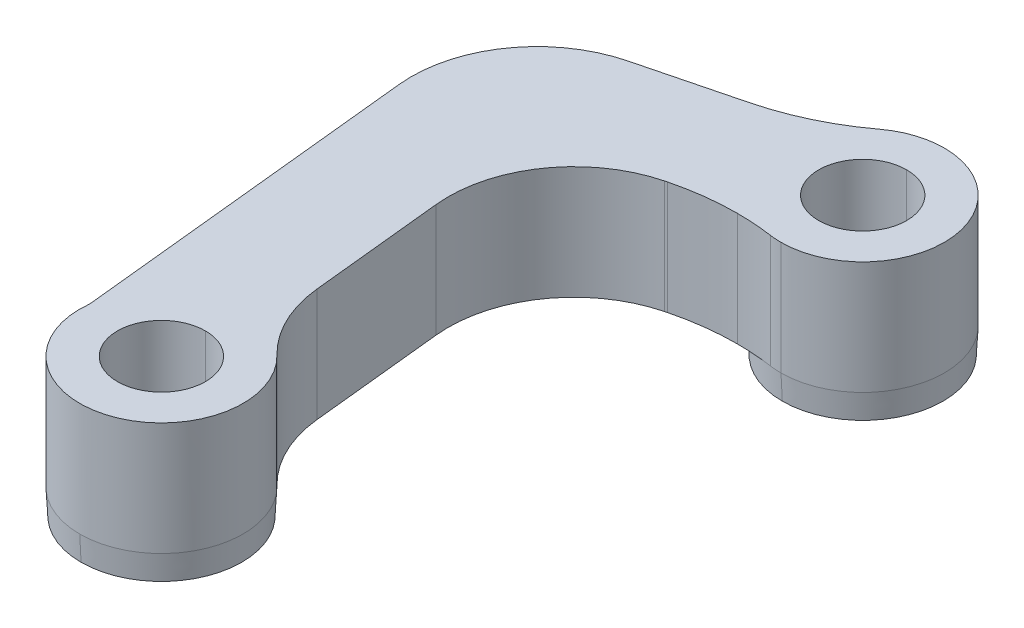
ISO-10303-21;
HEADER;
FILE_DESCRIPTION(('STEP AP214'),'2;1');
FILE_NAME('part.step','',(''),(''),'','','');
FILE_SCHEMA(('AUTOMOTIVE_DESIGN { 1 0 10303 214 1 1 1 1 }'));
ENDSEC;
DATA;
#1=APPLICATION_CONTEXT('core data for automotive mechanical design processes');
#2=APPLICATION_PROTOCOL_DEFINITION('international standard','automotive_design',2000,#1);
#3=PRODUCT_CONTEXT('',#1,'mechanical');
#4=PRODUCT('Part','Part','',(#3));
#5=PRODUCT_RELATED_PRODUCT_CATEGORY('part','',(#4));
#6=PRODUCT_DEFINITION_FORMATION('','',#4);
#7=PRODUCT_DEFINITION_CONTEXT('part definition',#1,'design');
#8=PRODUCT_DEFINITION('design','',#6,#7);
#9=PRODUCT_DEFINITION_SHAPE('','',#8);
#10=(LENGTH_UNIT() NAMED_UNIT(*) SI_UNIT(.MILLI.,.METRE.));
#11=(NAMED_UNIT(*) PLANE_ANGLE_UNIT() SI_UNIT($,.RADIAN.));
#12=(NAMED_UNIT(*) SI_UNIT($,.STERADIAN.) SOLID_ANGLE_UNIT());
#13=UNCERTAINTY_MEASURE_WITH_UNIT(LENGTH_MEASURE(1.E-05),#10,'distance_accuracy_value','');
#14=(GEOMETRIC_REPRESENTATION_CONTEXT(3) GLOBAL_UNCERTAINTY_ASSIGNED_CONTEXT((#13)) GLOBAL_UNIT_ASSIGNED_CONTEXT((#10,
#11,#12)) REPRESENTATION_CONTEXT('',''));
#15=CARTESIAN_POINT('',(0.,0.,0.));
#16=DIRECTION('',(0.,0.,1.));
#17=DIRECTION('',(1.,0.,0.));
#18=AXIS2_PLACEMENT_3D('',#15,#16,#17);
#19=CARTESIAN_POINT('',(8.4,0.,-19.5));
#20=DIRECTION('',(0.,-1.,0.));
#21=DIRECTION('',(0.,0.,-1.));
#22=AXIS2_PLACEMENT_3D('',#19,#20,#21);
#23=CONICAL_SURFACE('',#22,1.75,0.0523598775598306);
#24=DIRECTION('',(0.,-0.998629534754574,0.0523359562429439));
#25=VECTOR('',#24,1.);
#26=CARTESIAN_POINT('',(8.4,0.,-17.75));
#27=LINE('',#26,#25);
#28=CARTESIAN_POINT('',(8.4,0.,-17.75));
#29=VERTEX_POINT('',#28);
#30=CARTESIAN_POINT('',(8.4,-1.,-17.6975922207169));
#31=VERTEX_POINT('',#30);
#32=EDGE_CURVE('E479',#29,#31,#27,.T.);
#33=ORIENTED_EDGE('',*,*,#32,.F.);
#34=CARTESIAN_POINT('',(8.4,0.,-19.5));
#35=DIRECTION('',(0.,1.,0.));
#36=DIRECTION('',(0.,0.,1.));
#37=AXIS2_PLACEMENT_3D('',#34,#35,#36);
#38=CIRCLE('',#37,1.75);
#39=CARTESIAN_POINT('',(8.4,0.,-21.25));
#40=VERTEX_POINT('',#39);
#41=EDGE_CURVE('E94',#29,#40,#38,.T.);
#42=ORIENTED_EDGE('',*,*,#41,.T.);
#43=DIRECTION('',(0.,-0.998629534754574,-0.0523359562429439));
#44=VECTOR('',#43,1.);
#45=CARTESIAN_POINT('',(8.4,0.,-21.25));
#46=LINE('',#45,#44);
#47=CARTESIAN_POINT('',(8.4,-1.,-21.3024077792831));
#48=VERTEX_POINT('',#47);
#49=EDGE_CURVE('E478',#40,#48,#46,.T.);
#50=ORIENTED_EDGE('',*,*,#49,.T.);
#51=CARTESIAN_POINT('',(8.4,-1.,-19.5));
#52=DIRECTION('',(0.,-1.,0.));
#53=DIRECTION('',(0.,0.,-1.));
#54=AXIS2_PLACEMENT_3D('',#51,#52,#53);
#55=CIRCLE('',#54,1.80240777928305);
#56=EDGE_CURVE('E11',#48,#31,#55,.T.);
#57=ORIENTED_EDGE('',*,*,#56,.T.);
#58=EDGE_LOOP('',(#33,#42,#50,#57));
#59=FACE_BOUND('',#58,.T.);
#60=ADVANCED_FACE('F17',(#59),#23,.F.);
#61=CARTESIAN_POINT('',(8.4,0.,-19.5));
#62=DIRECTION('',(0.,1.,0.));
#63=DIRECTION('',(0.,0.,-1.));
#64=AXIS2_PLACEMENT_3D('',#61,#62,#63);
#65=CONICAL_SURFACE('',#64,3.25,0.0523598775598306);
#66=DIRECTION('',(0.,0.998629534754574,0.0523359562429439));
#67=VECTOR('',#66,1.);
#68=CARTESIAN_POINT('',(8.4,0.,-16.25));
#69=LINE('',#68,#67);
#70=CARTESIAN_POINT('',(8.4,-1.,-16.302407779283));
#71=VERTEX_POINT('',#70);
#72=CARTESIAN_POINT('',(8.4,0.,-16.25));
#73=VERTEX_POINT('',#72);
#74=EDGE_CURVE('E460',#71,#73,#69,.T.);
#75=ORIENTED_EDGE('',*,*,#74,.F.);
#76=CARTESIAN_POINT('',(8.4,-1.,-19.5));
#77=DIRECTION('',(0.,-1.,0.));
#78=DIRECTION('',(0.,0.,-1.));
#79=AXIS2_PLACEMENT_3D('',#76,#77,#78);
#80=CIRCLE('',#79,3.19759222071696);
#81=CARTESIAN_POINT('',(8.4,-1.,-22.6975922207169));
#82=VERTEX_POINT('',#81);
#83=EDGE_CURVE('E26',#82,#71,#80,.T.);
#84=ORIENTED_EDGE('',*,*,#83,.F.);
#85=DIRECTION('',(0.,0.998629534754574,-0.0523359562429439));
#86=VECTOR('',#85,1.);
#87=CARTESIAN_POINT('',(8.4,0.,-22.75));
#88=LINE('',#87,#86);
#89=CARTESIAN_POINT('',(8.4,0.,-22.75));
#90=VERTEX_POINT('',#89);
#91=EDGE_CURVE('E448',#82,#90,#88,.T.);
#92=ORIENTED_EDGE('',*,*,#91,.T.);
#93=CARTESIAN_POINT('',(8.4,0.,-19.5));
#94=DIRECTION('',(0.,1.,0.));
#95=DIRECTION('',(0.,0.,1.));
#96=AXIS2_PLACEMENT_3D('',#93,#94,#95);
#97=CIRCLE('',#96,3.25);
#98=EDGE_CURVE('E261',#73,#90,#97,.T.);
#99=ORIENTED_EDGE('',*,*,#98,.F.);
#100=EDGE_LOOP('',(#75,#84,#92,#99));
#101=FACE_BOUND('',#100,.T.);
#102=ADVANCED_FACE('F578',(#101),#65,.T.);
#103=CARTESIAN_POINT('',(8.4,-1.,-19.5));
#104=DIRECTION('',(0.,-1.,0.));
#105=DIRECTION('',(-1.,0.,0.));
#106=AXIS2_PLACEMENT_3D('',#103,#104,#105);
#107=PLANE('',#106);
#108=ORIENTED_EDGE('',*,*,#56,.F.);
#109=CARTESIAN_POINT('',(8.4,-1.,-19.5));
#110=DIRECTION('',(0.,-1.,0.));
#111=DIRECTION('',(0.,0.,-1.));
#112=AXIS2_PLACEMENT_3D('',#109,#110,#111);
#113=CIRCLE('',#112,1.80240777928305);
#114=EDGE_CURVE('E474',#31,#48,#113,.T.);
#115=ORIENTED_EDGE('',*,*,#114,.F.);
#116=EDGE_LOOP('',(#108,#115));
#117=FACE_BOUND('',#116,.T.);
#118=ORIENTED_EDGE('',*,*,#83,.T.);
#119=CARTESIAN_POINT('',(8.4,-1.,-19.5));
#120=DIRECTION('',(0.,-1.,0.));
#121=DIRECTION('',(0.,0.,-1.));
#122=AXIS2_PLACEMENT_3D('',#119,#120,#121);
#123=CIRCLE('',#122,3.19759222071696);
#124=EDGE_CURVE('E464',#71,#82,#123,.T.);
#125=ORIENTED_EDGE('',*,*,#124,.T.);
#126=EDGE_LOOP('',(#118,#125));
#127=FACE_BOUND('',#126,.T.);
#128=ADVANCED_FACE('F588',(#117,#127),#107,.T.);
#129=CARTESIAN_POINT('',(0.,0.,0.));
#130=DIRECTION('',(0.,-1.,0.));
#131=DIRECTION('',(0.,0.,-1.));
#132=AXIS2_PLACEMENT_3D('',#129,#130,#131);
#133=CONICAL_SURFACE('',#132,1.75,0.0523598775598306);
#134=DIRECTION('',(0.,-0.998629534754574,0.0523359562429439));
#135=VECTOR('',#134,1.);
#136=CARTESIAN_POINT('',(0.,0.,1.75));
#137=LINE('',#136,#135);
#138=CARTESIAN_POINT('',(0.,0.,1.75));
#139=VERTEX_POINT('',#138);
#140=CARTESIAN_POINT('',(0.,-1.,1.80240777928304));
#141=VERTEX_POINT('',#140);
#142=EDGE_CURVE('E229',#139,#141,#137,.T.);
#143=ORIENTED_EDGE('',*,*,#142,.F.);
#144=CARTESIAN_POINT('',(0.,0.,0.));
#145=DIRECTION('',(0.,1.,0.));
#146=DIRECTION('',(0.,0.,1.));
#147=AXIS2_PLACEMENT_3D('',#144,#145,#146);
#148=CIRCLE('',#147,1.75);
#149=CARTESIAN_POINT('',(0.,0.,-1.75));
#150=VERTEX_POINT('',#149);
#151=EDGE_CURVE('E142',#139,#150,#148,.T.);
#152=ORIENTED_EDGE('',*,*,#151,.T.);
#153=DIRECTION('',(0.,-0.998629534754574,-0.0523359562429439));
#154=VECTOR('',#153,1.);
#155=CARTESIAN_POINT('',(0.,0.,-1.75));
#156=LINE('',#155,#154);
#157=CARTESIAN_POINT('',(0.,-1.,-1.80240777928304));
#158=VERTEX_POINT('',#157);
#159=EDGE_CURVE('E237',#150,#158,#156,.T.);
#160=ORIENTED_EDGE('',*,*,#159,.T.);
#161=CARTESIAN_POINT('',(0.,-1.,0.));
#162=DIRECTION('',(0.,-1.,0.));
#163=DIRECTION('',(0.,0.,-1.));
#164=AXIS2_PLACEMENT_3D('',#161,#162,#163);
#165=CIRCLE('',#164,1.80240777928304);
#166=EDGE_CURVE('E20',#158,#141,#165,.T.);
#167=ORIENTED_EDGE('',*,*,#166,.T.);
#168=EDGE_LOOP('',(#143,#152,#160,#167));
#169=FACE_BOUND('',#168,.T.);
#170=ADVANCED_FACE('F598',(#169),#133,.F.);
#171=CARTESIAN_POINT('',(0.,0.,0.));
#172=DIRECTION('',(0.,1.,0.));
#173=DIRECTION('',(0.,0.,-1.));
#174=AXIS2_PLACEMENT_3D('',#171,#172,#173);
#175=CONICAL_SURFACE('',#174,3.25,0.0523598775598306);
#176=DIRECTION('',(0.,0.998629534754574,0.0523359562429439));
#177=VECTOR('',#176,1.);
#178=CARTESIAN_POINT('',(0.,0.,3.25));
#179=LINE('',#178,#177);
#180=CARTESIAN_POINT('',(0.,-1.,3.19759222071696));
#181=VERTEX_POINT('',#180);
#182=CARTESIAN_POINT('',(0.,0.,3.25));
#183=VERTEX_POINT('',#182);
#184=EDGE_CURVE('E248',#181,#183,#179,.T.);
#185=ORIENTED_EDGE('',*,*,#184,.F.);
#186=CARTESIAN_POINT('',(0.,-1.,0.));
#187=DIRECTION('',(0.,-1.,0.));
#188=DIRECTION('',(0.,0.,-1.));
#189=AXIS2_PLACEMENT_3D('',#186,#187,#188);
#190=CIRCLE('',#189,3.19759222071696);
#191=CARTESIAN_POINT('',(0.,-1.,-3.19759222071696));
#192=VERTEX_POINT('',#191);
#193=EDGE_CURVE('E163',#192,#181,#190,.T.);
#194=ORIENTED_EDGE('',*,*,#193,.F.);
#195=DIRECTION('',(0.,0.998629534754574,-0.0523359562429439));
#196=VECTOR('',#195,1.);
#197=CARTESIAN_POINT('',(0.,0.,-3.25));
#198=LINE('',#197,#196);
#199=CARTESIAN_POINT('',(0.,0.,-3.25));
#200=VERTEX_POINT('',#199);
#201=EDGE_CURVE('E260',#192,#200,#198,.T.);
#202=ORIENTED_EDGE('',*,*,#201,.T.);
#203=CARTESIAN_POINT('',(0.,0.,0.));
#204=DIRECTION('',(0.,-1.,0.));
#205=DIRECTION('',(0.,0.,-1.));
#206=AXIS2_PLACEMENT_3D('',#203,#204,#205);
#207=CIRCLE('',#206,3.25);
#208=CARTESIAN_POINT('',(2.26618996291476,0.,-2.32956713832943));
#209=VERTEX_POINT('',#208);
#210=EDGE_CURVE('E185',#200,#209,#207,.T.);
#211=ORIENTED_EDGE('',*,*,#210,.T.);
#212=CARTESIAN_POINT('',(0.,0.,0.));
#213=DIRECTION('',(0.,1.,0.));
#214=DIRECTION('',(0.,0.,1.));
#215=AXIS2_PLACEMENT_3D('',#212,#213,#214);
#216=CIRCLE('',#215,3.25);
#217=EDGE_CURVE('E125',#183,#209,#216,.T.);
#218=ORIENTED_EDGE('',*,*,#217,.F.);
#219=EDGE_LOOP('',(#185,#194,#202,#211,#218));
#220=FACE_BOUND('',#219,.T.);
#221=ADVANCED_FACE('F354',(#220),#175,.T.);
#222=CARTESIAN_POINT('',(0.,-1.,0.));
#223=DIRECTION('',(0.,-1.,0.));
#224=DIRECTION('',(-1.,0.,0.));
#225=AXIS2_PLACEMENT_3D('',#222,#223,#224);
#226=PLANE('',#225);
#227=ORIENTED_EDGE('',*,*,#166,.F.);
#228=CARTESIAN_POINT('',(0.,-1.,0.));
#229=DIRECTION('',(0.,-1.,0.));
#230=DIRECTION('',(0.,0.,-1.));
#231=AXIS2_PLACEMENT_3D('',#228,#229,#230);
#232=CIRCLE('',#231,1.80240777928304);
#233=EDGE_CURVE('E233',#141,#158,#232,.T.);
#234=ORIENTED_EDGE('',*,*,#233,.F.);
#235=EDGE_LOOP('',(#227,#234));
#236=FACE_BOUND('',#235,.T.);
#237=ORIENTED_EDGE('',*,*,#193,.T.);
#238=CARTESIAN_POINT('',(0.,-1.,0.));
#239=DIRECTION('',(0.,-1.,0.));
#240=DIRECTION('',(0.,0.,-1.));
#241=AXIS2_PLACEMENT_3D('',#238,#239,#240);
#242=CIRCLE('',#241,3.19759222071696);
#243=EDGE_CURVE('E240',#181,#192,#242,.T.);
#244=ORIENTED_EDGE('',*,*,#243,.T.);
#245=EDGE_LOOP('',(#237,#244));
#246=FACE_BOUND('',#245,.T.);
#247=ADVANCED_FACE('F619',(#236,#246),#226,.T.);
#248=CARTESIAN_POINT('',(0.481766502932818,4.5,-30.1237506694163));
#249=DIRECTION('',(0.,-1.,0.));
#250=DIRECTION('',(0.,0.,-1.));
#251=AXIS2_PLACEMENT_3D('',#248,#249,#250);
#252=CYLINDRICAL_SURFACE('',#251,10.);
#253=CARTESIAN_POINT('',(0.481766502932818,4.5,-30.1237506694163));
#254=DIRECTION('',(0.,-1.,0.));
#255=DIRECTION('',(0.,0.,1.));
#256=AXIS2_PLACEMENT_3D('',#253,#254,#255);
#257=CIRCLE('',#256,10.);
#258=CARTESIAN_POINT('',(6.45779178373823,4.5,-22.1058256358946));
#259=VERTEX_POINT('',#258);
#260=CARTESIAN_POINT('',(2.9510323862635,4.5,-20.4334087767161));
#261=VERTEX_POINT('',#260);
#262=EDGE_CURVE('E161',#259,#261,#257,.T.);
#263=ORIENTED_EDGE('',*,*,#262,.F.);
#264=DIRECTION('',(0.,1.,0.));
#265=VECTOR('',#264,1.);
#266=CARTESIAN_POINT('',(6.45779178373823,4.5,-22.1058256358946));
#267=LINE('',#266,#265);
#268=CARTESIAN_POINT('',(6.45779178373824,0.,-22.1058256358946));
#269=VERTEX_POINT('',#268);
#270=EDGE_CURVE('E247',#269,#259,#267,.T.);
#271=ORIENTED_EDGE('',*,*,#270,.F.);
#272=CARTESIAN_POINT('',(0.481766502932818,0.,-30.1237506694163));
#273=DIRECTION('',(0.,1.,0.));
#274=DIRECTION('',(0.,0.,1.));
#275=AXIS2_PLACEMENT_3D('',#272,#273,#274);
#276=CIRCLE('',#275,10.);
#277=CARTESIAN_POINT('',(2.9510323862635,0.,-20.4334087767161));
#278=VERTEX_POINT('',#277);
#279=EDGE_CURVE('E192',#278,#269,#276,.T.);
#280=ORIENTED_EDGE('',*,*,#279,.F.);
#281=DIRECTION('',(0.,-1.,0.));
#282=VECTOR('',#281,1.);
#283=CARTESIAN_POINT('',(2.9510323862635,4.5,-20.4334087767161));
#284=LINE('',#283,#282);
#285=EDGE_CURVE('E120',#261,#278,#284,.T.);
#286=ORIENTED_EDGE('',*,*,#285,.F.);
#287=EDGE_LOOP('',(#263,#271,#280,#286));
#288=FACE_BOUND('',#287,.T.);
#289=ADVANCED_FACE('F439',(#288),#252,.F.);
#290=CARTESIAN_POINT('',(6.531467917093,4.5,-6.38241303230097));
#291=DIRECTION('',(0.,-1.,0.));
#292=DIRECTION('',(0.,0.,-1.));
#293=AXIS2_PLACEMENT_3D('',#290,#291,#292);
#294=CYLINDRICAL_SURFACE('',#293,10.);
#295=DIRECTION('',(0.,-1.,0.));
#296=VECTOR('',#295,1.);
#297=CARTESIAN_POINT('',(6.531467917093,4.5,-16.382413032301));
#298=LINE('',#297,#296);
#299=CARTESIAN_POINT('',(6.531467917093,4.5,-16.382413032301));
#300=VERTEX_POINT('',#299);
#301=CARTESIAN_POINT('',(6.531467917093,0.,-16.382413032301));
#302=VERTEX_POINT('',#301);
#303=EDGE_CURVE('E273',#300,#302,#298,.T.);
#304=ORIENTED_EDGE('',*,*,#303,.F.);
#305=CARTESIAN_POINT('',(6.531467917093,4.5,-6.38241303230097));
#306=DIRECTION('',(0.,-1.,0.));
#307=DIRECTION('',(0.,0.,1.));
#308=AXIS2_PLACEMENT_3D('',#305,#306,#307);
#309=CIRCLE('',#308,10.);
#310=CARTESIAN_POINT('',(4.0622020337623,4.5,-16.0727549250011));
#311=VERTEX_POINT('',#310);
#312=EDGE_CURVE('E158',#311,#300,#309,.T.);
#313=ORIENTED_EDGE('',*,*,#312,.F.);
#314=DIRECTION('',(0.,1.,0.));
#315=VECTOR('',#314,1.);
#316=CARTESIAN_POINT('',(4.0622020337623,4.5,-16.0727549250011));
#317=LINE('',#316,#315);
#318=CARTESIAN_POINT('',(4.0622020337623,0.,-16.0727549250011));
#319=VERTEX_POINT('',#318);
#320=EDGE_CURVE('E194',#319,#311,#317,.T.);
#321=ORIENTED_EDGE('',*,*,#320,.F.);
#322=CARTESIAN_POINT('',(6.531467917093,0.,-6.38241303230097));
#323=DIRECTION('',(0.,1.,0.));
#324=DIRECTION('',(0.,0.,1.));
#325=AXIS2_PLACEMENT_3D('',#322,#323,#324);
#326=CIRCLE('',#325,10.);
#327=EDGE_CURVE('E242',#302,#319,#326,.T.);
#328=ORIENTED_EDGE('',*,*,#327,.F.);
#329=EDGE_LOOP('',(#304,#313,#321,#328));
#330=FACE_BOUND('',#329,.T.);
#331=ADVANCED_FACE('F642',(#330),#294,.F.);
#332=CARTESIAN_POINT('',(5.75263605970669,4.5,-5.91351658191318));
#333=DIRECTION('',(0.,-1.,0.));
#334=DIRECTION('',(0.,0.,-1.));
#335=AXIS2_PLACEMENT_3D('',#332,#333,#334);
#336=CYLINDRICAL_SURFACE('',#335,5.);
#337=CARTESIAN_POINT('',(5.75263605970669,4.5,-5.91351658191318));
#338=DIRECTION('',(0.,-1.,0.));
#339=DIRECTION('',(0.,0.,1.));
#340=AXIS2_PLACEMENT_3D('',#337,#338,#339);
#341=CIRCLE('',#340,5.);
#342=CARTESIAN_POINT('',(2.26618996291476,4.5,-2.32956713832943));
#343=VERTEX_POINT('',#342);
#344=CARTESIAN_POINT('',(0.778821140406479,4.5,-5.40247338555245));
#345=VERTEX_POINT('',#344);
#346=EDGE_CURVE('E40',#343,#345,#341,.T.);
#347=ORIENTED_EDGE('',*,*,#346,.F.);
#348=DIRECTION('',(0.,1.,0.));
#349=VECTOR('',#348,1.);
#350=CARTESIAN_POINT('',(2.26618996291476,4.5,-2.32956713832943));
#351=LINE('',#350,#349);
#352=EDGE_CURVE('E128',#209,#343,#351,.T.);
#353=ORIENTED_EDGE('',*,*,#352,.F.);
#354=CARTESIAN_POINT('',(5.75263605970669,0.,-5.91351658191318));
#355=DIRECTION('',(0.,1.,0.));
#356=DIRECTION('',(0.,0.,1.));
#357=AXIS2_PLACEMENT_3D('',#354,#355,#356);
#358=CIRCLE('',#357,5.);
#359=CARTESIAN_POINT('',(0.778821140406479,0.,-5.40247338555245));
#360=VERTEX_POINT('',#359);
#361=EDGE_CURVE('E339',#360,#209,#358,.T.);
#362=ORIENTED_EDGE('',*,*,#361,.F.);
#363=DIRECTION('',(0.,-1.,0.));
#364=VECTOR('',#363,1.);
#365=CARTESIAN_POINT('',(0.778821140406486,0.,-5.40247338555245));
#366=LINE('',#365,#364);
#367=EDGE_CURVE('E133',#345,#360,#366,.T.);
#368=ORIENTED_EDGE('',*,*,#367,.F.);
#369=EDGE_LOOP('',(#347,#353,#362,#368));
#370=FACE_BOUND('',#369,.T.);
#371=ADVANCED_FACE('F636',(#370),#336,.F.);
#372=CARTESIAN_POINT('',(5.20893441571081,4.5,-11.2051854032821));
#373=DIRECTION('',(0.,1.,0.));
#374=DIRECTION('',(0.,0.,1.));
#375=AXIS2_PLACEMENT_3D('',#372,#373,#374);
#376=CYLINDRICAL_SURFACE('',#375,5.);
#377=CARTESIAN_POINT('',(5.20893441571081,4.5,-11.2051854032821));
#378=DIRECTION('',(0.,-1.,0.));
#379=DIRECTION('',(0.,0.,1.));
#380=AXIS2_PLACEMENT_3D('',#377,#378,#379);
#381=CIRCLE('',#380,5.);
#382=CARTESIAN_POINT('',(0.235119496410603,4.5,-10.6941422069214));
#383=VERTEX_POINT('',#382);
#384=CARTESIAN_POINT('',(3.97430147404547,4.5,-16.0503563496321));
#385=VERTEX_POINT('',#384);
#386=EDGE_CURVE('E54',#383,#385,#381,.T.);
#387=ORIENTED_EDGE('',*,*,#386,.F.);
#388=DIRECTION('',(0.,1.,0.));
#389=VECTOR('',#388,1.);
#390=CARTESIAN_POINT('',(0.235119496410602,4.5,-10.6941422069213));
#391=LINE('',#390,#389);
#392=CARTESIAN_POINT('',(0.235119496410601,0.,-10.6941422069214));
#393=VERTEX_POINT('',#392);
#394=EDGE_CURVE('E146',#393,#383,#391,.T.);
#395=ORIENTED_EDGE('',*,*,#394,.F.);
#396=CARTESIAN_POINT('',(5.20893441571081,0.,-11.2051854032821));
#397=DIRECTION('',(0.,1.,0.));
#398=DIRECTION('',(0.,0.,1.));
#399=AXIS2_PLACEMENT_3D('',#396,#397,#398);
#400=CIRCLE('',#399,5.);
#401=CARTESIAN_POINT('',(3.97430147404547,0.,-16.0503563496321));
#402=VERTEX_POINT('',#401);
#403=EDGE_CURVE('E330',#402,#393,#400,.T.);
#404=ORIENTED_EDGE('',*,*,#403,.F.);
#405=DIRECTION('',(0.,-1.,0.));
#406=VECTOR('',#405,1.);
#407=CARTESIAN_POINT('',(3.97430147404547,0.,-16.0503563496321));
#408=LINE('',#407,#406);
#409=EDGE_CURVE('E202',#385,#402,#408,.T.);
#410=ORIENTED_EDGE('',*,*,#409,.F.);
#411=EDGE_LOOP('',(#387,#395,#404,#410));
#412=FACE_BOUND('',#411,.T.);
#413=ADVANCED_FACE('F641',(#412),#376,.F.);
#414=CARTESIAN_POINT('',(0.335697927178731,4.5,-14.6071998793967));
#415=DIRECTION('',(0.,-1.,0.));
#416=DIRECTION('',(0.,0.,-1.));
#417=AXIS2_PLACEMENT_3D('',#414,#415,#416);
#418=CYLINDRICAL_SURFACE('',#417,5.);
#419=CARTESIAN_POINT('',(0.335697927178731,4.5,-14.6071998793967));
#420=DIRECTION('',(0.,1.,0.));
#421=DIRECTION('',(0.,0.,1.));
#422=AXIS2_PLACEMENT_3D('',#419,#420,#421);
#423=CIRCLE('',#422,5.);
#424=CARTESIAN_POINT('',(-0.898935014486618,4.5,-19.4523708257467));
#425=VERTEX_POINT('',#424);
#426=CARTESIAN_POINT('',(-4.63811699212148,4.5,-14.0961566830359));
#427=VERTEX_POINT('',#426);
#428=EDGE_CURVE('E82',#425,#427,#423,.T.);
#429=ORIENTED_EDGE('',*,*,#428,.F.);
#430=DIRECTION('',(0.,1.,0.));
#431=VECTOR('',#430,1.);
#432=CARTESIAN_POINT('',(-0.898935014486618,4.5,-19.4523708257467));
#433=LINE('',#432,#431);
#434=CARTESIAN_POINT('',(-0.898935014486618,0.,-19.4523708257467));
#435=VERTEX_POINT('',#434);
#436=EDGE_CURVE('E113',#435,#425,#433,.T.);
#437=ORIENTED_EDGE('',*,*,#436,.F.);
#438=CARTESIAN_POINT('',(0.335697927178731,0.,-14.6071998793967));
#439=DIRECTION('',(0.,-1.,0.));
#440=DIRECTION('',(0.,0.,1.));
#441=AXIS2_PLACEMENT_3D('',#438,#439,#440);
#442=CIRCLE('',#441,5.);
#443=CARTESIAN_POINT('',(-4.63811699212148,0.,-14.0961566830359));
#444=VERTEX_POINT('',#443);
#445=EDGE_CURVE('E102',#444,#435,#442,.T.);
#446=ORIENTED_EDGE('',*,*,#445,.F.);
#447=DIRECTION('',(0.,-1.,0.));
#448=VECTOR('',#447,1.);
#449=CARTESIAN_POINT('',(-4.63811699212149,4.5,-14.0961566830359));
#450=LINE('',#449,#448);
#451=EDGE_CURVE('E98',#427,#444,#450,.T.);
#452=ORIENTED_EDGE('',*,*,#451,.F.);
#453=EDGE_LOOP('',(#429,#437,#446,#452));
#454=FACE_BOUND('',#453,.T.);
#455=ADVANCED_FACE('F99',(#454),#418,.T.);
#456=CARTESIAN_POINT('',(0.,4.5,0.));
#457=DIRECTION('',(0.,1.,0.));
#458=DIRECTION('',(1.,0.,0.));
#459=AXIS2_PLACEMENT_3D('',#456,#457,#458);
#460=PLANE('',#459);
#461=CARTESIAN_POINT('',(8.4,4.5,-19.5));
#462=DIRECTION('',(0.,1.,0.));
#463=DIRECTION('',(0.,0.,1.));
#464=AXIS2_PLACEMENT_3D('',#461,#462,#463);
#465=CIRCLE('',#464,1.75);
#466=CARTESIAN_POINT('',(8.4,4.5,-21.25));
#467=VERTEX_POINT('',#466);
#468=CARTESIAN_POINT('',(8.4,4.5,-17.75));
#469=VERTEX_POINT('',#468);
#470=EDGE_CURVE('E285',#467,#469,#465,.T.);
#471=ORIENTED_EDGE('',*,*,#470,.F.);
#472=CARTESIAN_POINT('',(8.4,4.5,-19.5));
#473=DIRECTION('',(0.,1.,0.));
#474=DIRECTION('',(0.,0.,1.));
#475=AXIS2_PLACEMENT_3D('',#472,#473,#474);
#476=CIRCLE('',#475,1.75);
#477=EDGE_CURVE('E129',#469,#467,#476,.T.);
#478=ORIENTED_EDGE('',*,*,#477,.F.);
#479=EDGE_LOOP('',(#471,#478));
#480=FACE_BOUND('',#479,.T.);
#481=CARTESIAN_POINT('',(0.,4.5,0.));
#482=DIRECTION('',(0.,1.,0.));
#483=DIRECTION('',(0.,0.,1.));
#484=AXIS2_PLACEMENT_3D('',#481,#482,#483);
#485=CIRCLE('',#484,1.75);
#486=CARTESIAN_POINT('',(0.,4.5,-1.75));
#487=VERTEX_POINT('',#486);
#488=CARTESIAN_POINT('',(0.,4.5,1.75));
#489=VERTEX_POINT('',#488);
#490=EDGE_CURVE('E299',#487,#489,#485,.T.);
#491=ORIENTED_EDGE('',*,*,#490,.F.);
#492=CARTESIAN_POINT('',(0.,4.5,0.));
#493=DIRECTION('',(0.,1.,0.));
#494=DIRECTION('',(0.,0.,1.));
#495=AXIS2_PLACEMENT_3D('',#492,#493,#494);
#496=CIRCLE('',#495,1.75);
#497=EDGE_CURVE('E138',#489,#487,#496,.T.);
#498=ORIENTED_EDGE('',*,*,#497,.F.);
#499=EDGE_LOOP('',(#491,#498));
#500=FACE_BOUND('',#499,.T.);
#501=DIRECTION('',(0.969034189270013,0.,-0.24692658833307));
#502=VECTOR('',#501,1.);
#503=CARTESIAN_POINT('',(-4.70937978105626,4.5,-18.4814039221441));
#504=LINE('',#503,#502);
#505=EDGE_CURVE('E89',#425,#261,#504,.T.);
#506=ORIENTED_EDGE('',*,*,#505,.F.);
#507=ORIENTED_EDGE('',*,*,#428,.T.);
#508=DIRECTION('',(-0.102208639272146,0.,-0.994762983860043));
#509=VECTOR('',#508,1.);
#510=CARTESIAN_POINT('',(-3.15646064378525,4.5,0.324315995419832));
#511=LINE('',#510,#509);
#512=CARTESIAN_POINT('',(-3.22830360012599,4.5,-0.374907809219161));
#513=VERTEX_POINT('',#512);
#514=EDGE_CURVE('E86',#513,#427,#511,.T.);
#515=ORIENTED_EDGE('',*,*,#514,.F.);
#516=CARTESIAN_POINT('',(0.,4.5,0.));
#517=DIRECTION('',(0.,1.,0.));
#518=DIRECTION('',(0.,0.,1.));
#519=AXIS2_PLACEMENT_3D('',#516,#517,#518);
#520=CIRCLE('',#519,3.25);
#521=EDGE_CURVE('E137',#513,#343,#520,.T.);
#522=ORIENTED_EDGE('',*,*,#521,.T.);
#523=ORIENTED_EDGE('',*,*,#346,.T.);
#524=DIRECTION('',(-0.102208639272146,0.,-0.994762983860043));
#525=VECTOR('',#524,1.);
#526=CARTESIAN_POINT('',(1.31997278358494,4.5,-0.135622881304821));
#527=LINE('',#526,#525);
#528=EDGE_CURVE('E150',#345,#383,#527,.T.);
#529=ORIENTED_EDGE('',*,*,#528,.T.);
#530=ORIENTED_EDGE('',*,*,#386,.T.);
#531=DIRECTION('',(0.969034189270013,0.,-0.246926588333069));
#532=VECTOR('',#531,1.);
#533=CARTESIAN_POINT('',(-3.59821013355744,4.5,-14.120750070429));
#534=LINE('',#533,#532);
#535=EDGE_CURVE('E198',#385,#311,#534,.T.);
#536=ORIENTED_EDGE('',*,*,#535,.T.);
#537=ORIENTED_EDGE('',*,*,#312,.T.);
#538=CARTESIAN_POINT('',(6.531467917093,4.5,-6.38241303230097));
#539=DIRECTION('',(0.,-1.,0.));
#540=DIRECTION('',(0.,0.,1.));
#541=AXIS2_PLACEMENT_3D('',#538,#539,#540);
#542=CIRCLE('',#541,10.);
#543=CARTESIAN_POINT('',(7.94168080985299,4.5,-16.2824786683002));
#544=VERTEX_POINT('',#543);
#545=EDGE_CURVE('E270',#300,#544,#542,.T.);
#546=ORIENTED_EDGE('',*,*,#545,.T.);
#547=CARTESIAN_POINT('',(8.4,4.5,-19.5));
#548=DIRECTION('',(0.,1.,0.));
#549=DIRECTION('',(0.,0.,1.));
#550=AXIS2_PLACEMENT_3D('',#547,#548,#549);
#551=CIRCLE('',#550,3.25);
#552=CARTESIAN_POINT('',(8.4,4.5,-16.25));
#553=VERTEX_POINT('',#552);
#554=EDGE_CURVE('E205',#544,#553,#551,.T.);
#555=ORIENTED_EDGE('',*,*,#554,.T.);
#556=CARTESIAN_POINT('',(8.4,4.5,-19.5));
#557=DIRECTION('',(0.,1.,0.));
#558=DIRECTION('',(0.,0.,1.));
#559=AXIS2_PLACEMENT_3D('',#556,#557,#558);
#560=CIRCLE('',#559,3.25);
#561=CARTESIAN_POINT('',(8.4,4.5,-22.75));
#562=VERTEX_POINT('',#561);
#563=EDGE_CURVE('E309',#553,#562,#560,.T.);
#564=ORIENTED_EDGE('',*,*,#563,.T.);
#565=CARTESIAN_POINT('',(8.4,4.5,-19.5));
#566=DIRECTION('',(0.,1.,0.));
#567=DIRECTION('',(0.,0.,1.));
#568=AXIS2_PLACEMENT_3D('',#565,#566,#567);
#569=CIRCLE('',#568,3.25);
#570=EDGE_CURVE('E321',#562,#259,#569,.T.);
#571=ORIENTED_EDGE('',*,*,#570,.T.);
#572=ORIENTED_EDGE('',*,*,#262,.T.);
#573=EDGE_LOOP('',(#506,#507,#515,#522,#523,#529,#530,#536,#537,#546,#555,#564,#571,#572));
#574=FACE_BOUND('',#573,.T.);
#575=ADVANCED_FACE('F84',(#480,#500,#574),#460,.T.);
#576=CARTESIAN_POINT('',(8.4,4.5,-19.5));
#577=DIRECTION('',(0.,-1.,0.));
#578=DIRECTION('',(0.,0.,-1.));
#579=AXIS2_PLACEMENT_3D('',#576,#577,#578);
#580=CYLINDRICAL_SURFACE('',#579,1.75);
#581=DIRECTION('',(0.,-1.,0.));
#582=VECTOR('',#581,1.);
#583=CARTESIAN_POINT('',(8.4,4.5,-17.75));
#584=LINE('',#583,#582);
#585=EDGE_CURVE('E289',#469,#29,#584,.T.);
#586=ORIENTED_EDGE('',*,*,#585,.F.);
#587=ORIENTED_EDGE('',*,*,#477,.T.);
#588=DIRECTION('',(0.,-1.,0.));
#589=VECTOR('',#588,1.);
#590=CARTESIAN_POINT('',(8.4,4.5,-21.25));
#591=LINE('',#590,#589);
#592=EDGE_CURVE('E292',#467,#40,#591,.T.);
#593=ORIENTED_EDGE('',*,*,#592,.T.);
#594=ORIENTED_EDGE('',*,*,#41,.F.);
#595=EDGE_LOOP('',(#586,#587,#593,#594));
#596=FACE_BOUND('',#595,.T.);
#597=ADVANCED_FACE('F672',(#596),#580,.F.);
#598=CARTESIAN_POINT('',(1.31997278358494,4.5,-0.135622881304821));
#599=DIRECTION('',(-0.994762983860043,0.,0.102208639272146));
#600=DIRECTION('',(0.,1.,0.));
#601=AXIS2_PLACEMENT_3D('',#598,#599,#600);
#602=PLANE('',#601);
#603=DIRECTION('',(-0.102208639272146,0.,-0.994762983860043));
#604=VECTOR('',#603,1.);
#605=CARTESIAN_POINT('',(1.31997278358494,0.,-0.135622881304821));
#606=LINE('',#605,#604);
#607=EDGE_CURVE('E334',#360,#393,#606,.T.);
#608=ORIENTED_EDGE('',*,*,#607,.T.);
#609=ORIENTED_EDGE('',*,*,#394,.T.);
#610=ORIENTED_EDGE('',*,*,#528,.F.);
#611=ORIENTED_EDGE('',*,*,#367,.T.);
#612=EDGE_LOOP('',(#608,#609,#610,#611));
#613=FACE_BOUND('',#612,.T.);
#614=ADVANCED_FACE('F683',(#613),#602,.F.);
#615=CARTESIAN_POINT('',(0.,4.5,0.));
#616=DIRECTION('',(0.,-1.,0.));
#617=DIRECTION('',(0.,0.,-1.));
#618=AXIS2_PLACEMENT_3D('',#615,#616,#617);
#619=CYLINDRICAL_SURFACE('',#618,1.75);
#620=DIRECTION('',(0.,-1.,0.));
#621=VECTOR('',#620,1.);
#622=CARTESIAN_POINT('',(0.,4.5,1.75));
#623=LINE('',#622,#621);
#624=EDGE_CURVE('E294',#489,#139,#623,.T.);
#625=ORIENTED_EDGE('',*,*,#624,.F.);
#626=ORIENTED_EDGE('',*,*,#497,.T.);
#627=DIRECTION('',(0.,-1.,0.));
#628=VECTOR('',#627,1.);
#629=CARTESIAN_POINT('',(0.,4.5,-1.75));
#630=LINE('',#629,#628);
#631=EDGE_CURVE('E298',#487,#150,#630,.T.);
#632=ORIENTED_EDGE('',*,*,#631,.T.);
#633=ORIENTED_EDGE('',*,*,#151,.F.);
#634=EDGE_LOOP('',(#625,#626,#632,#633));
#635=FACE_BOUND('',#634,.T.);
#636=ADVANCED_FACE('F691',(#635),#619,.F.);
#637=CARTESIAN_POINT('',(0.,4.5,0.));
#638=DIRECTION('',(0.,-1.,0.));
#639=DIRECTION('',(0.,0.,-1.));
#640=AXIS2_PLACEMENT_3D('',#637,#638,#639);
#641=CYLINDRICAL_SURFACE('',#640,3.25);
#642=CARTESIAN_POINT('',(0.,0.,0.));
#643=DIRECTION('',(0.,1.,0.));
#644=DIRECTION('',(0.,0.,1.));
#645=AXIS2_PLACEMENT_3D('',#642,#643,#644);
#646=CIRCLE('',#645,3.25);
#647=CARTESIAN_POINT('',(-3.22830360012599,0.,-0.374907809219161));
#648=VERTEX_POINT('',#647);
#649=EDGE_CURVE('E252',#648,#183,#646,.T.);
#650=ORIENTED_EDGE('',*,*,#649,.T.);
#651=ORIENTED_EDGE('',*,*,#217,.T.);
#652=ORIENTED_EDGE('',*,*,#352,.T.);
#653=ORIENTED_EDGE('',*,*,#521,.F.);
#654=DIRECTION('',(0.,-1.,0.));
#655=VECTOR('',#654,1.);
#656=CARTESIAN_POINT('',(-3.22830360012599,4.5,-0.374907809219161));
#657=LINE('',#656,#655);
#658=EDGE_CURVE('E107',#513,#648,#657,.T.);
#659=ORIENTED_EDGE('',*,*,#658,.T.);
#660=EDGE_LOOP('',(#650,#651,#652,#653,#659));
#661=FACE_BOUND('',#660,.T.);
#662=ADVANCED_FACE('F696',(#661),#641,.T.);
#663=CARTESIAN_POINT('',(-3.15646064378525,4.5,0.324315995419832));
#664=DIRECTION('',(-0.994762983860043,0.,0.102208639272146));
#665=DIRECTION('',(0.,1.,0.));
#666=AXIS2_PLACEMENT_3D('',#663,#664,#665);
#667=PLANE('',#666);
#668=ORIENTED_EDGE('',*,*,#514,.T.);
#669=ORIENTED_EDGE('',*,*,#451,.T.);
#670=DIRECTION('',(-0.102208639272146,0.,-0.994762983860043));
#671=VECTOR('',#670,1.);
#672=CARTESIAN_POINT('',(-3.15646064378525,0.,0.324315995419832));
#673=LINE('',#672,#671);
#674=EDGE_CURVE('E187',#648,#444,#673,.T.);
#675=ORIENTED_EDGE('',*,*,#674,.F.);
#676=ORIENTED_EDGE('',*,*,#658,.F.);
#677=EDGE_LOOP('',(#668,#669,#675,#676));
#678=FACE_BOUND('',#677,.T.);
#679=ADVANCED_FACE('F110',(#678),#667,.T.);
#680=CARTESIAN_POINT('',(-4.70937978105626,4.5,-18.4814039221441));
#681=DIRECTION('',(-0.24692658833307,0.,-0.969034189270013));
#682=DIRECTION('',(-0.969034189270013,0.,0.24692658833307));
#683=AXIS2_PLACEMENT_3D('',#680,#681,#682);
#684=PLANE('',#683);
#685=ORIENTED_EDGE('',*,*,#505,.T.);
#686=ORIENTED_EDGE('',*,*,#285,.T.);
#687=DIRECTION('',(0.969034189270013,0.,-0.24692658833307));
#688=VECTOR('',#687,1.);
#689=CARTESIAN_POINT('',(-4.70937978105626,0.,-18.4814039221441));
#690=LINE('',#689,#688);
#691=EDGE_CURVE('E189',#435,#278,#690,.T.);
#692=ORIENTED_EDGE('',*,*,#691,.F.);
#693=ORIENTED_EDGE('',*,*,#436,.T.);
#694=EDGE_LOOP('',(#685,#686,#692,#693));
#695=FACE_BOUND('',#694,.T.);
#696=ADVANCED_FACE('F426',(#695),#684,.T.);
#697=CARTESIAN_POINT('',(8.4,4.5,-19.5));
#698=DIRECTION('',(0.,-1.,0.));
#699=DIRECTION('',(0.,0.,-1.));
#700=AXIS2_PLACEMENT_3D('',#697,#698,#699);
#701=CYLINDRICAL_SURFACE('',#700,3.25);
#702=DIRECTION('',(0.,-1.,0.));
#703=VECTOR('',#702,1.);
#704=CARTESIAN_POINT('',(8.4,4.5,-16.25));
#705=LINE('',#704,#703);
#706=EDGE_CURVE('E266',#553,#73,#705,.T.);
#707=ORIENTED_EDGE('',*,*,#706,.F.);
#708=ORIENTED_EDGE('',*,*,#554,.F.);
#709=DIRECTION('',(0.,-1.,0.));
#710=VECTOR('',#709,1.);
#711=CARTESIAN_POINT('',(7.94168080985299,4.5,-16.2824786683002));
#712=LINE('',#711,#710);
#713=CARTESIAN_POINT('',(7.94168080985299,0.,-16.2824786683002));
#714=VERTEX_POINT('',#713);
#715=EDGE_CURVE('E281',#544,#714,#712,.T.);
#716=ORIENTED_EDGE('',*,*,#715,.T.);
#717=CARTESIAN_POINT('',(8.4,0.,-19.5));
#718=DIRECTION('',(0.,1.,0.));
#719=DIRECTION('',(0.,0.,1.));
#720=AXIS2_PLACEMENT_3D('',#717,#718,#719);
#721=CIRCLE('',#720,3.25);
#722=EDGE_CURVE('E453',#714,#73,#721,.T.);
#723=ORIENTED_EDGE('',*,*,#722,.T.);
#724=EDGE_LOOP('',(#707,#708,#716,#723));
#725=FACE_BOUND('',#724,.T.);
#726=ADVANCED_FACE('F709',(#725),#701,.T.);
#727=CARTESIAN_POINT('',(-3.59821013355744,4.5,-14.120750070429));
#728=DIRECTION('',(-0.246926588333069,0.,-0.969034189270013));
#729=DIRECTION('',(-0.969034189270013,0.,0.246926588333069));
#730=AXIS2_PLACEMENT_3D('',#727,#728,#729);
#731=PLANE('',#730);
#732=DIRECTION('',(0.969034189270013,0.,-0.246926588333069));
#733=VECTOR('',#732,1.);
#734=CARTESIAN_POINT('',(-3.59821013355744,0.,-14.120750070429));
#735=LINE('',#734,#733);
#736=EDGE_CURVE('E246',#402,#319,#735,.T.);
#737=ORIENTED_EDGE('',*,*,#736,.T.);
#738=ORIENTED_EDGE('',*,*,#320,.T.);
#739=ORIENTED_EDGE('',*,*,#535,.F.);
#740=ORIENTED_EDGE('',*,*,#409,.T.);
#741=EDGE_LOOP('',(#737,#738,#739,#740));
#742=FACE_BOUND('',#741,.T.);
#743=ADVANCED_FACE('F704',(#742),#731,.F.);
#744=CARTESIAN_POINT('',(0.,0.,0.));
#745=DIRECTION('',(0.,1.,0.));
#746=DIRECTION('',(1.,0.,0.));
#747=AXIS2_PLACEMENT_3D('',#744,#745,#746);
#748=PLANE('',#747);
#749=CARTESIAN_POINT('',(8.4,0.,-19.5));
#750=DIRECTION('',(0.,-1.,0.));
#751=DIRECTION('',(0.,0.,-1.));
#752=AXIS2_PLACEMENT_3D('',#749,#750,#751);
#753=CIRCLE('',#752,3.25);
#754=EDGE_CURVE('E432',#714,#269,#753,.T.);
#755=ORIENTED_EDGE('',*,*,#754,.F.);
#756=CARTESIAN_POINT('',(6.531467917093,0.,-6.38241303230097));
#757=DIRECTION('',(0.,1.,0.));
#758=DIRECTION('',(0.,0.,1.));
#759=AXIS2_PLACEMENT_3D('',#756,#757,#758);
#760=CIRCLE('',#759,10.);
#761=EDGE_CURVE('E277',#714,#302,#760,.T.);
#762=ORIENTED_EDGE('',*,*,#761,.T.);
#763=ORIENTED_EDGE('',*,*,#327,.T.);
#764=ORIENTED_EDGE('',*,*,#736,.F.);
#765=ORIENTED_EDGE('',*,*,#403,.T.);
#766=ORIENTED_EDGE('',*,*,#607,.F.);
#767=ORIENTED_EDGE('',*,*,#361,.T.);
#768=ORIENTED_EDGE('',*,*,#210,.F.);
#769=CARTESIAN_POINT('',(0.,0.,0.));
#770=DIRECTION('',(0.,-1.,0.));
#771=DIRECTION('',(0.,0.,-1.));
#772=AXIS2_PLACEMENT_3D('',#769,#770,#771);
#773=CIRCLE('',#772,3.25);
#774=EDGE_CURVE('E256',#648,#200,#773,.T.);
#775=ORIENTED_EDGE('',*,*,#774,.F.);
#776=ORIENTED_EDGE('',*,*,#674,.T.);
#777=ORIENTED_EDGE('',*,*,#445,.T.);
#778=ORIENTED_EDGE('',*,*,#691,.T.);
#779=ORIENTED_EDGE('',*,*,#279,.T.);
#780=EDGE_LOOP('',(#755,#762,#763,#764,#765,#766,#767,#768,#775,#776,#777,#778,#779));
#781=FACE_BOUND('',#780,.T.);
#782=ADVANCED_FACE('F364',(#781),#748,.F.);
#783=CARTESIAN_POINT('',(8.4,4.5,-19.5));
#784=DIRECTION('',(0.,-1.,0.));
#785=DIRECTION('',(0.,0.,-1.));
#786=AXIS2_PLACEMENT_3D('',#783,#784,#785);
#787=CYLINDRICAL_SURFACE('',#786,3.25);
#788=ORIENTED_EDGE('',*,*,#570,.F.);
#789=DIRECTION('',(0.,-1.,0.));
#790=VECTOR('',#789,1.);
#791=CARTESIAN_POINT('',(8.4,4.5,-22.75));
#792=LINE('',#791,#790);
#793=EDGE_CURVE('E265',#562,#90,#792,.T.);
#794=ORIENTED_EDGE('',*,*,#793,.T.);
#795=CARTESIAN_POINT('',(8.4,0.,-19.5));
#796=DIRECTION('',(0.,1.,0.));
#797=DIRECTION('',(0.,0.,1.));
#798=AXIS2_PLACEMENT_3D('',#795,#796,#797);
#799=CIRCLE('',#798,3.25);
#800=EDGE_CURVE('E442',#90,#269,#799,.T.);
#801=ORIENTED_EDGE('',*,*,#800,.T.);
#802=ORIENTED_EDGE('',*,*,#270,.T.);
#803=EDGE_LOOP('',(#788,#794,#801,#802));
#804=FACE_BOUND('',#803,.T.);
#805=ADVANCED_FACE('F443',(#804),#787,.T.);
#806=CARTESIAN_POINT('',(8.4,4.5,-19.5));
#807=DIRECTION('',(0.,-1.,0.));
#808=DIRECTION('',(0.,0.,-1.));
#809=AXIS2_PLACEMENT_3D('',#806,#807,#808);
#810=CYLINDRICAL_SURFACE('',#809,3.25);
#811=ORIENTED_EDGE('',*,*,#563,.F.);
#812=ORIENTED_EDGE('',*,*,#706,.T.);
#813=ORIENTED_EDGE('',*,*,#98,.T.);
#814=ORIENTED_EDGE('',*,*,#793,.F.);
#815=EDGE_LOOP('',(#811,#812,#813,#814));
#816=FACE_BOUND('',#815,.T.);
#817=ADVANCED_FACE('F730',(#816),#810,.T.);
#818=CARTESIAN_POINT('',(0.,4.5,0.));
#819=DIRECTION('',(0.,-1.,0.));
#820=DIRECTION('',(0.,0.,-1.));
#821=AXIS2_PLACEMENT_3D('',#818,#819,#820);
#822=CYLINDRICAL_SURFACE('',#821,1.75);
#823=ORIENTED_EDGE('',*,*,#490,.T.);
#824=ORIENTED_EDGE('',*,*,#624,.T.);
#825=CARTESIAN_POINT('',(0.,0.,0.));
#826=DIRECTION('',(0.,1.,0.));
#827=DIRECTION('',(0.,0.,1.));
#828=AXIS2_PLACEMENT_3D('',#825,#826,#827);
#829=CIRCLE('',#828,1.75);
#830=EDGE_CURVE('E226',#150,#139,#829,.T.);
#831=ORIENTED_EDGE('',*,*,#830,.F.);
#832=ORIENTED_EDGE('',*,*,#631,.F.);
#833=EDGE_LOOP('',(#823,#824,#831,#832));
#834=FACE_BOUND('',#833,.T.);
#835=ADVANCED_FACE('F747',(#834),#822,.F.);
#836=CARTESIAN_POINT('',(8.4,4.5,-19.5));
#837=DIRECTION('',(0.,-1.,0.));
#838=DIRECTION('',(0.,0.,-1.));
#839=AXIS2_PLACEMENT_3D('',#836,#837,#838);
#840=CYLINDRICAL_SURFACE('',#839,1.75);
#841=ORIENTED_EDGE('',*,*,#470,.T.);
#842=ORIENTED_EDGE('',*,*,#585,.T.);
#843=CARTESIAN_POINT('',(8.4,0.,-19.5));
#844=DIRECTION('',(0.,1.,0.));
#845=DIRECTION('',(0.,0.,1.));
#846=AXIS2_PLACEMENT_3D('',#843,#844,#845);
#847=CIRCLE('',#846,1.75);
#848=EDGE_CURVE('E493',#40,#29,#847,.T.);
#849=ORIENTED_EDGE('',*,*,#848,.F.);
#850=ORIENTED_EDGE('',*,*,#592,.F.);
#851=EDGE_LOOP('',(#841,#842,#849,#850));
#852=FACE_BOUND('',#851,.T.);
#853=ADVANCED_FACE('F511',(#852),#840,.F.);
#854=CARTESIAN_POINT('',(6.531467917093,4.5,-6.38241303230097));
#855=DIRECTION('',(0.,-1.,0.));
#856=DIRECTION('',(0.,0.,-1.));
#857=AXIS2_PLACEMENT_3D('',#854,#855,#856);
#858=CYLINDRICAL_SURFACE('',#857,10.);
#859=ORIENTED_EDGE('',*,*,#545,.F.);
#860=ORIENTED_EDGE('',*,*,#303,.T.);
#861=ORIENTED_EDGE('',*,*,#761,.F.);
#862=ORIENTED_EDGE('',*,*,#715,.F.);
#863=EDGE_LOOP('',(#859,#860,#861,#862));
#864=FACE_BOUND('',#863,.T.);
#865=ADVANCED_FACE('F768',(#864),#858,.F.);
#866=CARTESIAN_POINT('',(0.,0.,0.));
#867=DIRECTION('',(0.,1.,0.));
#868=DIRECTION('',(0.,0.,-1.));
#869=AXIS2_PLACEMENT_3D('',#866,#867,#868);
#870=CONICAL_SURFACE('',#869,3.25,0.0523598775598306);
#871=ORIENTED_EDGE('',*,*,#243,.F.);
#872=ORIENTED_EDGE('',*,*,#184,.T.);
#873=ORIENTED_EDGE('',*,*,#649,.F.);
#874=ORIENTED_EDGE('',*,*,#774,.T.);
#875=ORIENTED_EDGE('',*,*,#201,.F.);
#876=EDGE_LOOP('',(#871,#872,#873,#874,#875));
#877=FACE_BOUND('',#876,.T.);
#878=ADVANCED_FACE('F773',(#877),#870,.T.);
#879=CARTESIAN_POINT('',(0.,0.,0.));
#880=DIRECTION('',(0.,-1.,0.));
#881=DIRECTION('',(0.,0.,-1.));
#882=AXIS2_PLACEMENT_3D('',#879,#880,#881);
#883=CONICAL_SURFACE('',#882,1.75,0.0523598775598306);
#884=ORIENTED_EDGE('',*,*,#830,.T.);
#885=ORIENTED_EDGE('',*,*,#142,.T.);
#886=ORIENTED_EDGE('',*,*,#233,.T.);
#887=ORIENTED_EDGE('',*,*,#159,.F.);
#888=EDGE_LOOP('',(#884,#885,#886,#887));
#889=FACE_BOUND('',#888,.T.);
#890=ADVANCED_FACE('F793',(#889),#883,.F.);
#891=CARTESIAN_POINT('',(8.4,0.,-19.5));
#892=DIRECTION('',(0.,1.,0.));
#893=DIRECTION('',(0.,0.,-1.));
#894=AXIS2_PLACEMENT_3D('',#891,#892,#893);
#895=CONICAL_SURFACE('',#894,3.25,0.0523598775598306);
#896=ORIENTED_EDGE('',*,*,#124,.F.);
#897=ORIENTED_EDGE('',*,*,#74,.T.);
#898=ORIENTED_EDGE('',*,*,#722,.F.);
#899=ORIENTED_EDGE('',*,*,#754,.T.);
#900=ORIENTED_EDGE('',*,*,#800,.F.);
#901=ORIENTED_EDGE('',*,*,#91,.F.);
#902=EDGE_LOOP('',(#896,#897,#898,#899,#900,#901));
#903=FACE_BOUND('',#902,.T.);
#904=ADVANCED_FACE('F450',(#903),#895,.T.);
#905=CARTESIAN_POINT('',(8.4,0.,-19.5));
#906=DIRECTION('',(0.,-1.,0.));
#907=DIRECTION('',(0.,0.,-1.));
#908=AXIS2_PLACEMENT_3D('',#905,#906,#907);
#909=CONICAL_SURFACE('',#908,1.75,0.0523598775598306);
#910=ORIENTED_EDGE('',*,*,#848,.T.);
#911=ORIENTED_EDGE('',*,*,#32,.T.);
#912=ORIENTED_EDGE('',*,*,#114,.T.);
#913=ORIENTED_EDGE('',*,*,#49,.F.);
#914=EDGE_LOOP('',(#910,#911,#912,#913));
#915=FACE_BOUND('',#914,.T.);
#916=ADVANCED_FACE('F502',(#915),#909,.F.);
#917=CLOSED_SHELL('',(#60,#102,#128,#170,#221,#247,#289,#331,#371,#413,#455,#575,#597,#614,#636,
#662,#679,#696,#726,#743,#782,#805,#817,#835,#853,#865,#878,#890,#904,#916));
#918=MANIFOLD_SOLID_BREP('B1',#917);
#919=ADVANCED_BREP_SHAPE_REPRESENTATION('',(#18,#918),#14);
#920=SHAPE_DEFINITION_REPRESENTATION(#9,#919);
ENDSEC;
END-ISO-10303-21;
